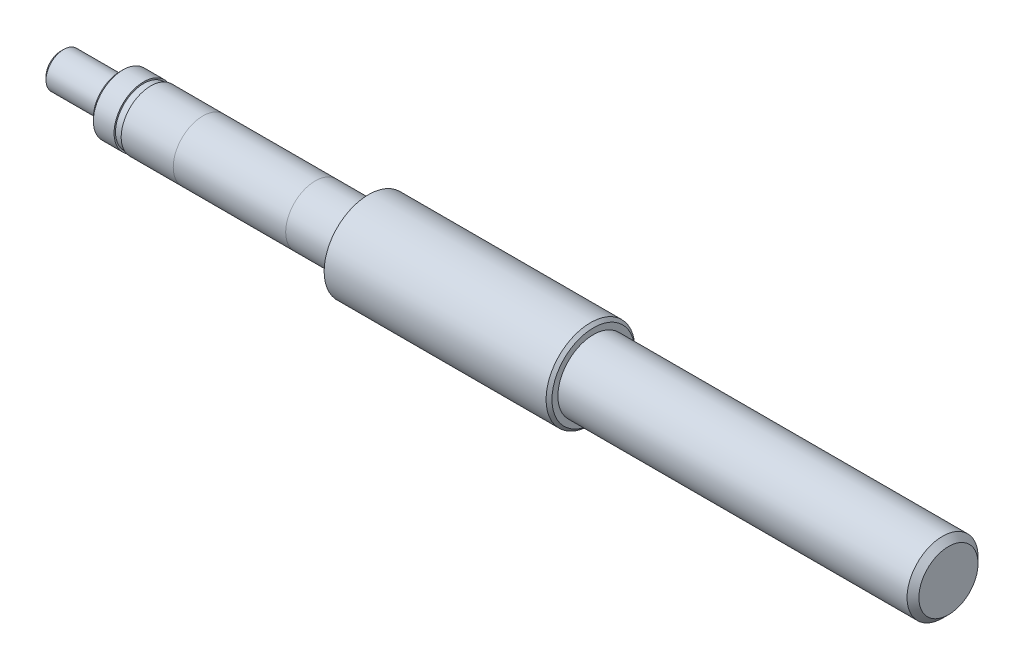
ISO-10303-21;
HEADER;
FILE_DESCRIPTION(('STEP AP214'),'2;1');
FILE_NAME('part.step','',(''),(''),'','','');
FILE_SCHEMA(('AUTOMOTIVE_DESIGN { 1 0 10303 214 1 1 1 1 }'));
ENDSEC;
DATA;
#1=APPLICATION_CONTEXT('core data for automotive mechanical design processes');
#2=APPLICATION_PROTOCOL_DEFINITION('international standard','automotive_design',2000,#1);
#3=PRODUCT_CONTEXT('',#1,'mechanical');
#4=PRODUCT('Part','Part','',(#3));
#5=PRODUCT_RELATED_PRODUCT_CATEGORY('part','',(#4));
#6=PRODUCT_DEFINITION_FORMATION('','',#4);
#7=PRODUCT_DEFINITION_CONTEXT('part definition',#1,'design');
#8=PRODUCT_DEFINITION('design','',#6,#7);
#9=PRODUCT_DEFINITION_SHAPE('','',#8);
#10=(LENGTH_UNIT() NAMED_UNIT(*) SI_UNIT(.MILLI.,.METRE.));
#11=(NAMED_UNIT(*) PLANE_ANGLE_UNIT() SI_UNIT($,.RADIAN.));
#12=(NAMED_UNIT(*) SI_UNIT($,.STERADIAN.) SOLID_ANGLE_UNIT());
#13=UNCERTAINTY_MEASURE_WITH_UNIT(LENGTH_MEASURE(1.E-05),#10,'distance_accuracy_value','');
#14=(GEOMETRIC_REPRESENTATION_CONTEXT(3) GLOBAL_UNCERTAINTY_ASSIGNED_CONTEXT((#13)) GLOBAL_UNIT_ASSIGNED_CONTEXT((#10,
#11,#12)) REPRESENTATION_CONTEXT('',''));
#15=CARTESIAN_POINT('',(0.,0.,0.));
#16=DIRECTION('',(0.,0.,1.));
#17=DIRECTION('',(1.,0.,0.));
#18=AXIS2_PLACEMENT_3D('',#15,#16,#17);
#19=CARTESIAN_POINT('',(65.,0.,0.));
#20=DIRECTION('',(-1.,0.,0.));
#21=DIRECTION('',(0.,0.,1.));
#22=AXIS2_PLACEMENT_3D('',#19,#20,#21);
#23=CYLINDRICAL_SURFACE('',#22,5.0000000000001);
#24=CARTESIAN_POINT('',(36.,0.,0.));
#25=DIRECTION('',(-1.,0.,0.));
#26=DIRECTION('',(0.,0.,1.));
#27=AXIS2_PLACEMENT_3D('',#24,#25,#26);
#28=CIRCLE('',#27,5.0000000000001);
#29=CARTESIAN_POINT('',(36.,0.,5.0000000000001));
#30=VERTEX_POINT('',#29);
#31=EDGE_CURVE('E64',#30,#30,#28,.F.);
#32=ORIENTED_EDGE('',*,*,#31,.F.);
#33=EDGE_LOOP('',(#32));
#34=FACE_BOUND('',#33,.T.);
#35=CARTESIAN_POINT('',(17.,0.,0.));
#36=DIRECTION('',(-1.,0.,0.));
#37=DIRECTION('',(0.,0.,1.));
#38=AXIS2_PLACEMENT_3D('',#35,#36,#37);
#39=CIRCLE('',#38,5.0000000000001);
#40=CARTESIAN_POINT('',(17.,0.,-5.00000000000015));
#41=VERTEX_POINT('',#40);
#42=CARTESIAN_POINT('',(17.,0.,5.00000000000015));
#43=VERTEX_POINT('',#42);
#44=EDGE_CURVE('E49',#41,#43,#39,.F.);
#45=ORIENTED_EDGE('',*,*,#44,.T.);
#46=EDGE_CURVE('E11',#43,#41,#39,.F.);
#47=ORIENTED_EDGE('',*,*,#46,.T.);
#48=EDGE_LOOP('',(#45,#47));
#49=FACE_BOUND('',#48,.T.);
#50=ADVANCED_FACE('F45',(#34,#49),#23,.T.);
#51=CARTESIAN_POINT('',(43.85,0.,0.));
#52=DIRECTION('',(-1.,0.,0.));
#53=DIRECTION('',(0.,0.,1.));
#54=AXIS2_PLACEMENT_3D('',#51,#52,#53);
#55=CIRCLE('',#54,5.00000000000017);
#56=CARTESIAN_POINT('',(43.85,0.,5.00000000000017));
#57=VERTEX_POINT('',#56);
#58=EDGE_CURVE('E107',#57,#57,#55,.T.);
#59=ORIENTED_EDGE('',*,*,#58,.T.);
#60=EDGE_LOOP('',(#59));
#61=FACE_BOUND('',#60,.T.);
#62=ORIENTED_EDGE('',*,*,#31,.T.);
#63=EDGE_LOOP('',(#62));
#64=FACE_BOUND('',#63,.T.);
#65=ADVANCED_FACE('F149',(#61,#64),#23,.T.);
#66=CARTESIAN_POINT('',(-6.99999999999999,0.,0.));
#67=DIRECTION('',(1.,0.,0.));
#68=DIRECTION('',(0.,0.,-1.));
#69=AXIS2_PLACEMENT_3D('',#66,#67,#68);
#70=CONICAL_SURFACE('',#69,2.50000000000016,0.785398163397448);
#71=CARTESIAN_POINT('',(-6.49999999999999,0.,0.));
#72=DIRECTION('',(-1.,0.,0.));
#73=DIRECTION('',(0.,0.,1.));
#74=AXIS2_PLACEMENT_3D('',#71,#72,#73);
#75=CIRCLE('',#74,3.00000000000016);
#76=CARTESIAN_POINT('',(-6.49999999999999,0.,3.00000000000016));
#77=VERTEX_POINT('',#76);
#78=EDGE_CURVE('E131',#77,#77,#75,.T.);
#79=ORIENTED_EDGE('',*,*,#78,.T.);
#80=EDGE_LOOP('',(#79));
#81=FACE_BOUND('',#80,.T.);
#82=CARTESIAN_POINT('',(-6.99999999999999,0.,0.));
#83=DIRECTION('',(-1.,0.,0.));
#84=DIRECTION('',(0.,0.,1.));
#85=AXIS2_PLACEMENT_3D('',#82,#83,#84);
#86=CIRCLE('',#85,2.50000000000016);
#87=CARTESIAN_POINT('',(-6.99999999999999,0.,2.50000000000016));
#88=VERTEX_POINT('',#87);
#89=EDGE_CURVE('E69',#88,#88,#86,.T.);
#90=ORIENTED_EDGE('',*,*,#89,.F.);
#91=EDGE_LOOP('',(#90));
#92=FACE_BOUND('',#91,.T.);
#93=ADVANCED_FACE('F47',(#81,#92),#70,.T.);
#94=CARTESIAN_POINT('',(-6.99999999999999,0.,0.));
#95=DIRECTION('',(-1.,0.,0.));
#96=DIRECTION('',(0.,0.,1.));
#97=AXIS2_PLACEMENT_3D('',#94,#95,#96);
#98=PLANE('',#97);
#99=ORIENTED_EDGE('',*,*,#89,.T.);
#100=EDGE_LOOP('',(#99));
#101=FACE_BOUND('',#100,.T.);
#102=ADVANCED_FACE('F210',(#101),#98,.T.);
#103=CARTESIAN_POINT('',(143.,0.,0.));
#104=DIRECTION('',(-1.,0.,0.));
#105=DIRECTION('',(0.,0.,1.));
#106=AXIS2_PLACEMENT_3D('',#103,#104,#105);
#107=PLANE('',#106);
#108=CARTESIAN_POINT('',(143.,0.,0.));
#109=DIRECTION('',(-1.,0.,0.));
#110=DIRECTION('',(0.,0.,1.));
#111=AXIS2_PLACEMENT_3D('',#108,#109,#110);
#112=CIRCLE('',#111,5.00000000000009);
#113=CARTESIAN_POINT('',(143.,0.,5.00000000000009));
#114=VERTEX_POINT('',#113);
#115=EDGE_CURVE('E75',#114,#114,#112,.T.);
#116=ORIENTED_EDGE('',*,*,#115,.F.);
#117=EDGE_LOOP('',(#116));
#118=FACE_BOUND('',#117,.T.);
#119=ADVANCED_FACE('F207',(#118),#107,.F.);
#120=CARTESIAN_POINT('',(143.,0.,0.));
#121=DIRECTION('',(-1.,0.,0.));
#122=DIRECTION('',(0.,0.,1.));
#123=AXIS2_PLACEMENT_3D('',#120,#121,#122);
#124=CONICAL_SURFACE('',#123,5.00000000000009,0.785398163397448);
#125=CARTESIAN_POINT('',(142.,0.,0.));
#126=DIRECTION('',(-1.,0.,0.));
#127=DIRECTION('',(0.,0.,1.));
#128=AXIS2_PLACEMENT_3D('',#125,#126,#127);
#129=CIRCLE('',#128,6.00000000000009);
#130=CARTESIAN_POINT('',(142.,0.,6.00000000000009));
#131=VERTEX_POINT('',#130);
#132=EDGE_CURVE('E80',#131,#131,#129,.T.);
#133=ORIENTED_EDGE('',*,*,#132,.F.);
#134=EDGE_LOOP('',(#133));
#135=FACE_BOUND('',#134,.T.);
#136=ORIENTED_EDGE('',*,*,#115,.T.);
#137=EDGE_LOOP('',(#136));
#138=FACE_BOUND('',#137,.T.);
#139=ADVANCED_FACE('F203',(#135,#138),#124,.T.);
#140=CARTESIAN_POINT('',(65.,0.,0.));
#141=DIRECTION('',(-1.,0.,0.));
#142=DIRECTION('',(0.,0.,1.));
#143=AXIS2_PLACEMENT_3D('',#140,#141,#142);
#144=CYLINDRICAL_SURFACE('',#143,6.00000000000009);
#145=CARTESIAN_POINT('',(83.,0.,0.));
#146=DIRECTION('',(-1.,0.,0.));
#147=DIRECTION('',(0.,0.,1.));
#148=AXIS2_PLACEMENT_3D('',#145,#146,#147);
#149=CIRCLE('',#148,6.00000000000009);
#150=CARTESIAN_POINT('',(83.,0.,6.00000000000009));
#151=VERTEX_POINT('',#150);
#152=EDGE_CURVE('E83',#151,#151,#149,.T.);
#153=ORIENTED_EDGE('',*,*,#152,.F.);
#154=EDGE_LOOP('',(#153));
#155=FACE_BOUND('',#154,.T.);
#156=ORIENTED_EDGE('',*,*,#132,.T.);
#157=EDGE_LOOP('',(#156));
#158=FACE_BOUND('',#157,.T.);
#159=ADVANCED_FACE('F199',(#155,#158),#144,.T.);
#160=CARTESIAN_POINT('',(83.,0.,0.));
#161=DIRECTION('',(-1.,0.,0.));
#162=DIRECTION('',(0.,0.,1.));
#163=AXIS2_PLACEMENT_3D('',#160,#161,#162);
#164=PLANE('',#163);
#165=CARTESIAN_POINT('',(83.,0.,0.));
#166=DIRECTION('',(-1.,0.,0.));
#167=DIRECTION('',(0.,0.,1.));
#168=AXIS2_PLACEMENT_3D('',#165,#166,#167);
#169=CIRCLE('',#168,7.00000000000018);
#170=CARTESIAN_POINT('',(83.,0.,7.00000000000018));
#171=VERTEX_POINT('',#170);
#172=EDGE_CURVE('E86',#171,#171,#169,.T.);
#173=ORIENTED_EDGE('',*,*,#172,.F.);
#174=EDGE_LOOP('',(#173));
#175=FACE_BOUND('',#174,.T.);
#176=ORIENTED_EDGE('',*,*,#152,.T.);
#177=EDGE_LOOP('',(#176));
#178=FACE_BOUND('',#177,.T.);
#179=ADVANCED_FACE('F195',(#175,#178),#164,.F.);
#180=CARTESIAN_POINT('',(82.5,0.,0.));
#181=DIRECTION('',(-1.,0.,0.));
#182=DIRECTION('',(0.,0.,1.));
#183=AXIS2_PLACEMENT_3D('',#180,#181,#182);
#184=CONICAL_SURFACE('',#183,7.50000000000016,0.785398163397455);
#185=ORIENTED_EDGE('',*,*,#172,.T.);
#186=EDGE_LOOP('',(#185));
#187=FACE_BOUND('',#186,.T.);
#188=CARTESIAN_POINT('',(82.5,0.,0.));
#189=DIRECTION('',(-1.,0.,0.));
#190=DIRECTION('',(0.,0.,1.));
#191=AXIS2_PLACEMENT_3D('',#188,#189,#190);
#192=CIRCLE('',#191,7.50000000000016);
#193=CARTESIAN_POINT('',(82.5,0.,7.50000000000016));
#194=VERTEX_POINT('',#193);
#195=EDGE_CURVE('E89',#194,#194,#192,.T.);
#196=ORIENTED_EDGE('',*,*,#195,.F.);
#197=EDGE_LOOP('',(#196));
#198=FACE_BOUND('',#197,.T.);
#199=ADVANCED_FACE('F191',(#187,#198),#184,.T.);
#200=CARTESIAN_POINT('',(65.,0.,0.));
#201=DIRECTION('',(-1.,0.,0.));
#202=DIRECTION('',(0.,0.,1.));
#203=AXIS2_PLACEMENT_3D('',#200,#201,#202);
#204=CYLINDRICAL_SURFACE('',#203,7.50000000000016);
#205=ORIENTED_EDGE('',*,*,#195,.T.);
#206=EDGE_LOOP('',(#205));
#207=FACE_BOUND('',#206,.T.);
#208=CARTESIAN_POINT('',(45.,0.,0.));
#209=DIRECTION('',(-1.,0.,0.));
#210=DIRECTION('',(0.,0.,1.));
#211=AXIS2_PLACEMENT_3D('',#208,#209,#210);
#212=CIRCLE('',#211,7.50000000000017);
#213=CARTESIAN_POINT('',(45.,0.,7.50000000000017));
#214=VERTEX_POINT('',#213);
#215=EDGE_CURVE('E92',#214,#214,#212,.T.);
#216=ORIENTED_EDGE('',*,*,#215,.F.);
#217=EDGE_LOOP('',(#216));
#218=FACE_BOUND('',#217,.T.);
#219=ADVANCED_FACE('F187',(#207,#218),#204,.T.);
#220=CARTESIAN_POINT('',(45.,0.,0.));
#221=DIRECTION('',(-1.,0.,0.));
#222=DIRECTION('',(0.,0.,1.));
#223=AXIS2_PLACEMENT_3D('',#220,#221,#222);
#224=PLANE('',#223);
#225=ORIENTED_EDGE('',*,*,#215,.T.);
#226=EDGE_LOOP('',(#225));
#227=FACE_BOUND('',#226,.T.);
#228=CARTESIAN_POINT('',(45.,0.,0.));
#229=DIRECTION('',(-1.,0.,0.));
#230=DIRECTION('',(0.,0.,1.));
#231=AXIS2_PLACEMENT_3D('',#228,#229,#230);
#232=CIRCLE('',#231,5.15000000000017);
#233=CARTESIAN_POINT('',(45.,0.,5.15000000000017));
#234=VERTEX_POINT('',#233);
#235=EDGE_CURVE('E95',#234,#234,#232,.T.);
#236=ORIENTED_EDGE('',*,*,#235,.F.);
#237=EDGE_LOOP('',(#236));
#238=FACE_BOUND('',#237,.T.);
#239=ADVANCED_FACE('F183',(#227,#238),#224,.T.);
#240=CARTESIAN_POINT('',(44.7,0.,0.));
#241=DIRECTION('',(-1.,0.,0.));
#242=DIRECTION('',(0.,0.,1.));
#243=AXIS2_PLACEMENT_3D('',#240,#241,#242);
#244=TOROIDAL_SURFACE('',#243,5.15000000000017,0.300000000000008);
#245=ORIENTED_EDGE('',*,*,#235,.T.);
#246=EDGE_LOOP('',(#245));
#247=FACE_BOUND('',#246,.T.);
#248=CARTESIAN_POINT('',(44.7,0.,0.));
#249=DIRECTION('',(-1.,0.,0.));
#250=DIRECTION('',(0.,0.,1.));
#251=AXIS2_PLACEMENT_3D('',#248,#249,#250);
#252=CIRCLE('',#251,4.85000000000017);
#253=CARTESIAN_POINT('',(44.7,0.,4.85000000000017));
#254=VERTEX_POINT('',#253);
#255=EDGE_CURVE('E98',#254,#254,#252,.T.);
#256=ORIENTED_EDGE('',*,*,#255,.F.);
#257=EDGE_LOOP('',(#256));
#258=FACE_BOUND('',#257,.T.);
#259=ADVANCED_FACE('F179',(#247,#258),#244,.F.);
#260=CARTESIAN_POINT('',(65.,0.,0.));
#261=DIRECTION('',(-1.,0.,0.));
#262=DIRECTION('',(0.,0.,1.));
#263=AXIS2_PLACEMENT_3D('',#260,#261,#262);
#264=CYLINDRICAL_SURFACE('',#263,4.85000000000017);
#265=CARTESIAN_POINT('',(44.0828427124746,0.,0.));
#266=DIRECTION('',(-1.,0.,0.));
#267=DIRECTION('',(0.,0.,1.));
#268=AXIS2_PLACEMENT_3D('',#265,#266,#267);
#269=CIRCLE('',#268,4.85000000000017);
#270=CARTESIAN_POINT('',(44.0828427124746,0.,4.85000000000017));
#271=VERTEX_POINT('',#270);
#272=EDGE_CURVE('E101',#271,#271,#269,.T.);
#273=ORIENTED_EDGE('',*,*,#272,.F.);
#274=EDGE_LOOP('',(#273));
#275=FACE_BOUND('',#274,.T.);
#276=ORIENTED_EDGE('',*,*,#255,.T.);
#277=EDGE_LOOP('',(#276));
#278=FACE_BOUND('',#277,.T.);
#279=ADVANCED_FACE('F172',(#275,#278),#264,.T.);
#280=CARTESIAN_POINT('',(44.0828427124746,0.,0.));
#281=DIRECTION('',(-1.,0.,0.));
#282=DIRECTION('',(0.,0.,1.));
#283=AXIS2_PLACEMENT_3D('',#280,#281,#282);
#284=TOROIDAL_SURFACE('',#283,5.05000000000017,0.200000000000003);
#285=ORIENTED_EDGE('',*,*,#272,.T.);
#286=EDGE_LOOP('',(#285));
#287=FACE_BOUND('',#286,.T.);
#288=CARTESIAN_POINT('',(43.9414213562373,0.,0.));
#289=DIRECTION('',(-1.,0.,0.));
#290=DIRECTION('',(0.,0.,1.));
#291=AXIS2_PLACEMENT_3D('',#288,#289,#290);
#292=CIRCLE('',#291,4.90857864376286);
#293=CARTESIAN_POINT('',(43.9414213562373,0.,4.90857864376286));
#294=VERTEX_POINT('',#293);
#295=EDGE_CURVE('E104',#294,#294,#292,.T.);
#296=ORIENTED_EDGE('',*,*,#295,.F.);
#297=EDGE_LOOP('',(#296));
#298=FACE_BOUND('',#297,.T.);
#299=ADVANCED_FACE('F167',(#287,#298),#284,.F.);
#300=CARTESIAN_POINT('',(43.85,0.,0.));
#301=DIRECTION('',(-1.,0.,0.));
#302=DIRECTION('',(0.,0.,1.));
#303=AXIS2_PLACEMENT_3D('',#300,#301,#302);
#304=CONICAL_SURFACE('',#303,5.00000000000017,0.785398163397467);
#305=ORIENTED_EDGE('',*,*,#295,.T.);
#306=EDGE_LOOP('',(#305));
#307=FACE_BOUND('',#306,.T.);
#308=ORIENTED_EDGE('',*,*,#58,.F.);
#309=EDGE_LOOP('',(#308));
#310=FACE_BOUND('',#309,.T.);
#311=ADVANCED_FACE('F160',(#307,#310),#304,.T.);
#312=ORIENTED_EDGE('',*,*,#46,.F.);
#313=ORIENTED_EDGE('',*,*,#44,.F.);
#314=EDGE_LOOP('',(#312,#313));
#315=FACE_BOUND('',#314,.T.);
#316=CARTESIAN_POINT('',(8.20000000000001,0.,0.));
#317=DIRECTION('',(-1.,0.,0.));
#318=DIRECTION('',(0.,0.,1.));
#319=AXIS2_PLACEMENT_3D('',#316,#317,#318);
#320=CIRCLE('',#319,5.00000000000002);
#321=CARTESIAN_POINT('',(8.20000000000001,0.,5.00000000000002));
#322=VERTEX_POINT('',#321);
#323=EDGE_CURVE('E110',#322,#322,#320,.T.);
#324=ORIENTED_EDGE('',*,*,#323,.F.);
#325=EDGE_LOOP('',(#324));
#326=FACE_BOUND('',#325,.T.);
#327=ADVANCED_FACE('F61',(#315,#326),#23,.T.);
#328=CARTESIAN_POINT('',(8.0556624327026,0.,0.));
#329=DIRECTION('',(1.,0.,0.));
#330=DIRECTION('',(0.,0.,-1.));
#331=AXIS2_PLACEMENT_3D('',#328,#329,#330);
#332=CONICAL_SURFACE('',#331,4.75000000000001,1.0471975511966);
#333=ORIENTED_EDGE('',*,*,#323,.T.);
#334=EDGE_LOOP('',(#333));
#335=FACE_BOUND('',#334,.T.);
#336=CARTESIAN_POINT('',(8.0556624327026,0.,0.));
#337=DIRECTION('',(-1.,0.,0.));
#338=DIRECTION('',(0.,0.,1.));
#339=AXIS2_PLACEMENT_3D('',#336,#337,#338);
#340=CIRCLE('',#339,4.75000000000001);
#341=CARTESIAN_POINT('',(8.0556624327026,0.,4.75000000000001));
#342=VERTEX_POINT('',#341);
#343=EDGE_CURVE('E113',#342,#342,#340,.T.);
#344=ORIENTED_EDGE('',*,*,#343,.F.);
#345=EDGE_LOOP('',(#344));
#346=FACE_BOUND('',#345,.T.);
#347=ADVANCED_FACE('F159',(#335,#346),#332,.T.);
#348=CARTESIAN_POINT('',(65.,0.,0.));
#349=DIRECTION('',(-1.,0.,0.));
#350=DIRECTION('',(0.,0.,1.));
#351=AXIS2_PLACEMENT_3D('',#348,#349,#350);
#352=CYLINDRICAL_SURFACE('',#351,4.75000000000001);
#353=CARTESIAN_POINT('',(7.00000000000001,0.,0.));
#354=DIRECTION('',(-1.,0.,0.));
#355=DIRECTION('',(0.,0.,1.));
#356=AXIS2_PLACEMENT_3D('',#353,#354,#355);
#357=CIRCLE('',#356,4.75000000000001);
#358=CARTESIAN_POINT('',(7.00000000000001,0.,4.75000000000001));
#359=VERTEX_POINT('',#358);
#360=EDGE_CURVE('E116',#359,#359,#357,.T.);
#361=ORIENTED_EDGE('',*,*,#360,.F.);
#362=EDGE_LOOP('',(#361));
#363=FACE_BOUND('',#362,.T.);
#364=ORIENTED_EDGE('',*,*,#343,.T.);
#365=EDGE_LOOP('',(#364));
#366=FACE_BOUND('',#365,.T.);
#367=ADVANCED_FACE('F165',(#363,#366),#352,.T.);
#368=CARTESIAN_POINT('',(7.00000000000001,0.,0.));
#369=DIRECTION('',(1.,0.,0.));
#370=DIRECTION('',(0.,0.,-1.));
#371=AXIS2_PLACEMENT_3D('',#368,#369,#370);
#372=PLANE('',#371);
#373=ORIENTED_EDGE('',*,*,#360,.T.);
#374=EDGE_LOOP('',(#373));
#375=FACE_BOUND('',#374,.T.);
#376=CARTESIAN_POINT('',(7.00000000000001,0.,0.));
#377=DIRECTION('',(-1.,0.,0.));
#378=DIRECTION('',(0.,0.,1.));
#379=AXIS2_PLACEMENT_3D('',#376,#377,#378);
#380=CIRCLE('',#379,5.00000000000015);
#381=CARTESIAN_POINT('',(7.00000000000001,0.,5.00000000000015));
#382=VERTEX_POINT('',#381);
#383=EDGE_CURVE('E119',#382,#382,#380,.T.);
#384=ORIENTED_EDGE('',*,*,#383,.F.);
#385=EDGE_LOOP('',(#384));
#386=FACE_BOUND('',#385,.T.);
#387=ADVANCED_FACE('F268',(#375,#386),#372,.T.);
#388=CARTESIAN_POINT('',(65.,0.,0.));
#389=DIRECTION('',(-1.,0.,0.));
#390=DIRECTION('',(0.,0.,1.));
#391=AXIS2_PLACEMENT_3D('',#388,#389,#390);
#392=CYLINDRICAL_SURFACE('',#391,5.00000000000015);
#393=ORIENTED_EDGE('',*,*,#383,.T.);
#394=EDGE_LOOP('',(#393));
#395=FACE_BOUND('',#394,.T.);
#396=CARTESIAN_POINT('',(3.50000000000001,0.,0.));
#397=DIRECTION('',(-1.,0.,0.));
#398=DIRECTION('',(0.,0.,1.));
#399=AXIS2_PLACEMENT_3D('',#396,#397,#398);
#400=CIRCLE('',#399,5.00000000000015);
#401=CARTESIAN_POINT('',(3.50000000000001,0.,5.00000000000015));
#402=VERTEX_POINT('',#401);
#403=EDGE_CURVE('E122',#402,#402,#400,.T.);
#404=ORIENTED_EDGE('',*,*,#403,.F.);
#405=EDGE_LOOP('',(#404));
#406=FACE_BOUND('',#405,.T.);
#407=ADVANCED_FACE('F258',(#395,#406),#392,.T.);
#408=CARTESIAN_POINT('',(3.00000000000001,0.,0.));
#409=DIRECTION('',(1.,0.,0.));
#410=DIRECTION('',(0.,0.,-1.));
#411=AXIS2_PLACEMENT_3D('',#408,#409,#410);
#412=CONICAL_SURFACE('',#411,4.50000000000015,0.785398163397448);
#413=ORIENTED_EDGE('',*,*,#403,.T.);
#414=EDGE_LOOP('',(#413));
#415=FACE_BOUND('',#414,.T.);
#416=CARTESIAN_POINT('',(3.00000000000001,0.,0.));
#417=DIRECTION('',(-1.,0.,0.));
#418=DIRECTION('',(0.,0.,1.));
#419=AXIS2_PLACEMENT_3D('',#416,#417,#418);
#420=CIRCLE('',#419,4.50000000000015);
#421=CARTESIAN_POINT('',(3.00000000000001,0.,4.50000000000015));
#422=VERTEX_POINT('',#421);
#423=EDGE_CURVE('E125',#422,#422,#420,.T.);
#424=ORIENTED_EDGE('',*,*,#423,.F.);
#425=EDGE_LOOP('',(#424));
#426=FACE_BOUND('',#425,.T.);
#427=ADVANCED_FACE('F145',(#415,#426),#412,.T.);
#428=CARTESIAN_POINT('',(3.00000000000001,0.,0.));
#429=DIRECTION('',(-1.,0.,0.));
#430=DIRECTION('',(0.,0.,1.));
#431=AXIS2_PLACEMENT_3D('',#428,#429,#430);
#432=PLANE('',#431);
#433=ORIENTED_EDGE('',*,*,#423,.T.);
#434=EDGE_LOOP('',(#433));
#435=FACE_BOUND('',#434,.T.);
#436=CARTESIAN_POINT('',(3.00000000000001,0.,0.));
#437=DIRECTION('',(-1.,0.,0.));
#438=DIRECTION('',(0.,0.,1.));
#439=AXIS2_PLACEMENT_3D('',#436,#437,#438);
#440=CIRCLE('',#439,3.00000000000016);
#441=CARTESIAN_POINT('',(3.00000000000001,0.,3.00000000000016));
#442=VERTEX_POINT('',#441);
#443=EDGE_CURVE('E128',#442,#442,#440,.T.);
#444=ORIENTED_EDGE('',*,*,#443,.F.);
#445=EDGE_LOOP('',(#444));
#446=FACE_BOUND('',#445,.T.);
#447=ADVANCED_FACE('F139',(#435,#446),#432,.T.);
#448=CARTESIAN_POINT('',(65.,0.,0.));
#449=DIRECTION('',(-1.,0.,0.));
#450=DIRECTION('',(0.,0.,1.));
#451=AXIS2_PLACEMENT_3D('',#448,#449,#450);
#452=CYLINDRICAL_SURFACE('',#451,3.00000000000016);
#453=ORIENTED_EDGE('',*,*,#443,.T.);
#454=EDGE_LOOP('',(#453));
#455=FACE_BOUND('',#454,.T.);
#456=ORIENTED_EDGE('',*,*,#78,.F.);
#457=EDGE_LOOP('',(#456));
#458=FACE_BOUND('',#457,.T.);
#459=ADVANCED_FACE('F137',(#455,#458),#452,.T.);
#460=CLOSED_SHELL('',(#50,#65,#93,#102,#119,#139,#159,#179,#199,#219,#239,#259,#279,#299,#311,
#327,#347,#367,#387,#407,#427,#447,#459));
#461=MANIFOLD_SOLID_BREP('B2',#460);
#462=ADVANCED_BREP_SHAPE_REPRESENTATION('',(#18,#461),#14);
#463=SHAPE_DEFINITION_REPRESENTATION(#9,#462);
ENDSEC;
END-ISO-10303-21;
